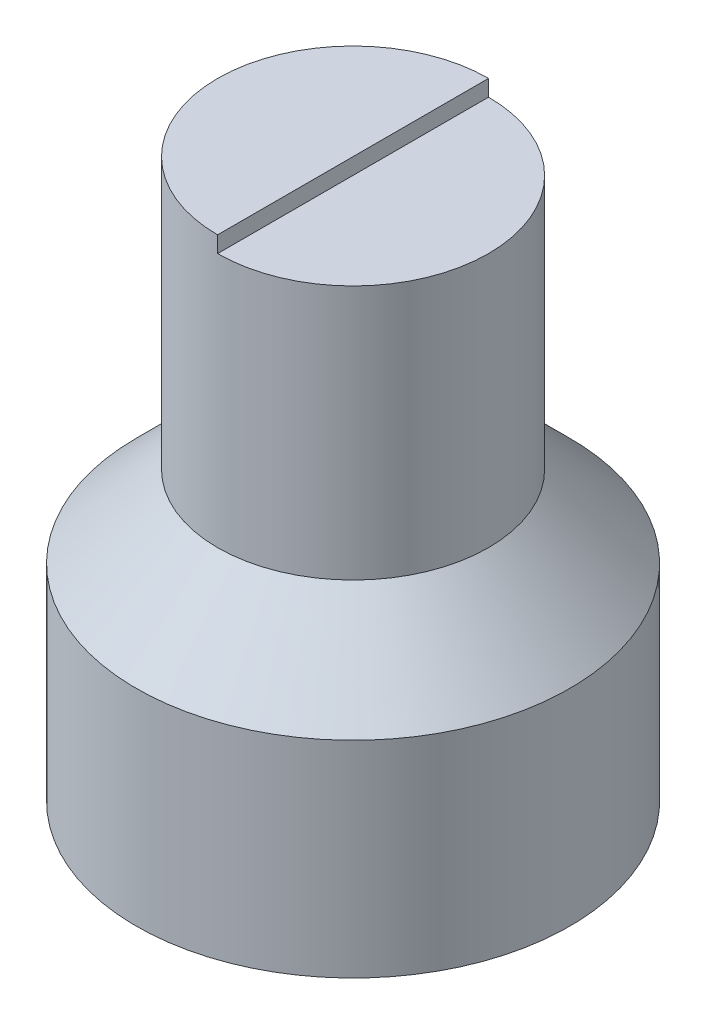
ISO-10303-21;
HEADER;
FILE_DESCRIPTION(('STEP AP214'),'2;1');
FILE_NAME('part.step','',(''),(''),'','','');
FILE_SCHEMA(('AUTOMOTIVE_DESIGN { 1 0 10303 214 1 1 1 1 }'));
ENDSEC;
DATA;
#1=APPLICATION_CONTEXT('core data for automotive mechanical design processes');
#2=APPLICATION_PROTOCOL_DEFINITION('international standard','automotive_design',2000,#1);
#3=PRODUCT_CONTEXT('',#1,'mechanical');
#4=PRODUCT('Part','Part','',(#3));
#5=PRODUCT_RELATED_PRODUCT_CATEGORY('part','',(#4));
#6=PRODUCT_DEFINITION_FORMATION('','',#4);
#7=PRODUCT_DEFINITION_CONTEXT('part definition',#1,'design');
#8=PRODUCT_DEFINITION('design','',#6,#7);
#9=PRODUCT_DEFINITION_SHAPE('','',#8);
#10=(LENGTH_UNIT() NAMED_UNIT(*) SI_UNIT(.MILLI.,.METRE.));
#11=(NAMED_UNIT(*) PLANE_ANGLE_UNIT() SI_UNIT($,.RADIAN.));
#12=(NAMED_UNIT(*) SI_UNIT($,.STERADIAN.) SOLID_ANGLE_UNIT());
#13=UNCERTAINTY_MEASURE_WITH_UNIT(LENGTH_MEASURE(1.E-05),#10,'distance_accuracy_value','');
#14=(GEOMETRIC_REPRESENTATION_CONTEXT(3) GLOBAL_UNCERTAINTY_ASSIGNED_CONTEXT((#13)) GLOBAL_UNIT_ASSIGNED_CONTEXT((#10,
#11,#12)) REPRESENTATION_CONTEXT('',''));
#15=CARTESIAN_POINT('',(0.,0.,0.));
#16=DIRECTION('',(0.,0.,1.));
#17=DIRECTION('',(1.,0.,0.));
#18=AXIS2_PLACEMENT_3D('',#15,#16,#17);
#19=CARTESIAN_POINT('',(0.,-10.3,0.));
#20=DIRECTION('',(0.,-1.,0.));
#21=DIRECTION('',(1.,0.,0.));
#22=AXIS2_PLACEMENT_3D('',#19,#20,#21);
#23=PLANE('',#22);
#24=CARTESIAN_POINT('',(0.,-10.3,0.));
#25=DIRECTION('',(0.,-1.,0.));
#26=DIRECTION('',(1.,0.,0.));
#27=AXIS2_PLACEMENT_3D('',#24,#25,#26);
#28=CIRCLE('',#27,5.1);
#29=CARTESIAN_POINT('',(5.1,-10.3,0.));
#30=VERTEX_POINT('',#29);
#31=EDGE_CURVE('E86',#30,#30,#28,.T.);
#32=ORIENTED_EDGE('',*,*,#31,.F.);
#33=EDGE_LOOP('',(#32));
#34=FACE_BOUND('',#33,.T.);
#35=CARTESIAN_POINT('',(0.,-10.3,0.));
#36=DIRECTION('',(0.,1.,0.));
#37=DIRECTION('',(-1.,0.,0.));
#38=AXIS2_PLACEMENT_3D('',#35,#36,#37);
#39=CIRCLE('',#38,8.);
#40=CARTESIAN_POINT('',(-8.,-10.3,0.));
#41=VERTEX_POINT('',#40);
#42=EDGE_CURVE('E117',#41,#41,#39,.T.);
#43=ORIENTED_EDGE('',*,*,#42,.F.);
#44=EDGE_LOOP('',(#43));
#45=FACE_BOUND('',#44,.T.);
#46=ADVANCED_FACE('F43',(#34,#45),#23,.T.);
#47=CARTESIAN_POINT('',(0.,10.3,0.));
#48=DIRECTION('',(0.,1.,0.));
#49=DIRECTION('',(-1.,0.,0.));
#50=AXIS2_PLACEMENT_3D('',#47,#48,#49);
#51=CYLINDRICAL_SURFACE('',#50,8.);
#52=CARTESIAN_POINT('',(0.,-2.70000000000001,0.));
#53=DIRECTION('',(0.,1.,0.));
#54=DIRECTION('',(-1.,0.,0.));
#55=AXIS2_PLACEMENT_3D('',#52,#53,#54);
#56=CIRCLE('',#55,8.);
#57=CARTESIAN_POINT('',(-8.,-2.70000000000001,0.));
#58=VERTEX_POINT('',#57);
#59=EDGE_CURVE('E11',#58,#58,#56,.F.);
#60=ORIENTED_EDGE('',*,*,#59,.T.);
#61=EDGE_LOOP('',(#60));
#62=FACE_BOUND('',#61,.T.);
#63=ORIENTED_EDGE('',*,*,#42,.T.);
#64=EDGE_LOOP('',(#63));
#65=FACE_BOUND('',#64,.T.);
#66=ADVANCED_FACE('F140',(#62,#65),#51,.T.);
#67=CARTESIAN_POINT('',(0.,10.3,0.));
#68=DIRECTION('',(0.,1.,0.));
#69=DIRECTION('',(-1.,0.,0.));
#70=AXIS2_PLACEMENT_3D('',#67,#68,#69);
#71=CYLINDRICAL_SURFACE('',#70,5.);
#72=DIRECTION('',(0.,1.,0.));
#73=VECTOR('',#72,1.);
#74=CARTESIAN_POINT('',(0.,9.7,5.));
#75=LINE('',#74,#73);
#76=CARTESIAN_POINT('',(0.,9.7,5.));
#77=VERTEX_POINT('',#76);
#78=CARTESIAN_POINT('',(0.,10.3,5.));
#79=VERTEX_POINT('',#78);
#80=EDGE_CURVE('E65',#77,#79,#75,.T.);
#81=ORIENTED_EDGE('',*,*,#80,.T.);
#82=CARTESIAN_POINT('',(0.,10.3,0.));
#83=DIRECTION('',(0.,1.,0.));
#84=DIRECTION('',(-1.,0.,0.));
#85=AXIS2_PLACEMENT_3D('',#82,#83,#84);
#86=CIRCLE('',#85,5.);
#87=CARTESIAN_POINT('',(0.,10.3,-5.));
#88=VERTEX_POINT('',#87);
#89=EDGE_CURVE('E107',#88,#79,#86,.T.);
#90=ORIENTED_EDGE('',*,*,#89,.F.);
#91=DIRECTION('',(0.,1.,0.));
#92=VECTOR('',#91,1.);
#93=CARTESIAN_POINT('',(0.,9.7,-5.));
#94=LINE('',#93,#92);
#95=CARTESIAN_POINT('',(0.,9.7,-5.));
#96=VERTEX_POINT('',#95);
#97=EDGE_CURVE('E59',#96,#88,#94,.T.);
#98=ORIENTED_EDGE('',*,*,#97,.F.);
#99=CARTESIAN_POINT('',(0.,9.7,0.));
#100=DIRECTION('',(0.,1.,0.));
#101=DIRECTION('',(-1.,0.,0.));
#102=AXIS2_PLACEMENT_3D('',#99,#100,#101);
#103=CIRCLE('',#102,5.);
#104=EDGE_CURVE('E52',#96,#77,#103,.F.);
#105=ORIENTED_EDGE('',*,*,#104,.T.);
#106=EDGE_LOOP('',(#81,#90,#98,#105));
#107=FACE_BOUND('',#106,.T.);
#108=CARTESIAN_POINT('',(0.,0.300000000000003,0.));
#109=DIRECTION('',(0.,1.,0.));
#110=DIRECTION('',(-1.,0.,0.));
#111=AXIS2_PLACEMENT_3D('',#108,#109,#110);
#112=CIRCLE('',#111,5.00000000000001);
#113=CARTESIAN_POINT('',(-5.00000000000001,0.300000000000002,0.));
#114=VERTEX_POINT('',#113);
#115=EDGE_CURVE('E113',#114,#114,#112,.T.);
#116=ORIENTED_EDGE('',*,*,#115,.T.);
#117=EDGE_LOOP('',(#116));
#118=FACE_BOUND('',#117,.T.);
#119=ADVANCED_FACE('F123',(#107,#118),#71,.T.);
#120=CARTESIAN_POINT('',(0.,10.3,0.));
#121=DIRECTION('',(0.,1.,0.));
#122=DIRECTION('',(-1.,0.,0.));
#123=AXIS2_PLACEMENT_3D('',#120,#121,#122);
#124=PLANE('',#123);
#125=DIRECTION('',(0.,0.,1.));
#126=VECTOR('',#125,1.);
#127=CARTESIAN_POINT('',(0.,10.3,5.));
#128=LINE('',#127,#126);
#129=EDGE_CURVE('E72',#88,#79,#128,.T.);
#130=ORIENTED_EDGE('',*,*,#129,.F.);
#131=ORIENTED_EDGE('',*,*,#89,.T.);
#132=EDGE_LOOP('',(#130,#131));
#133=FACE_BOUND('',#132,.T.);
#134=ADVANCED_FACE('F130',(#133),#124,.T.);
#135=CARTESIAN_POINT('',(0.,9.7,5.));
#136=DIRECTION('',(-1.,0.,0.));
#137=DIRECTION('',(0.,-1.,0.));
#138=AXIS2_PLACEMENT_3D('',#135,#136,#137);
#139=PLANE('',#138);
#140=ORIENTED_EDGE('',*,*,#129,.T.);
#141=ORIENTED_EDGE('',*,*,#80,.F.);
#142=DIRECTION('',(0.,0.,1.));
#143=VECTOR('',#142,1.);
#144=CARTESIAN_POINT('',(0.,9.7,5.));
#145=LINE('',#144,#143);
#146=EDGE_CURVE('E100',#96,#77,#145,.T.);
#147=ORIENTED_EDGE('',*,*,#146,.F.);
#148=ORIENTED_EDGE('',*,*,#97,.T.);
#149=EDGE_LOOP('',(#140,#141,#147,#148));
#150=FACE_BOUND('',#149,.T.);
#151=ADVANCED_FACE('F128',(#150),#139,.F.);
#152=CARTESIAN_POINT('',(0.,9.7,0.));
#153=DIRECTION('',(0.,1.,0.));
#154=DIRECTION('',(-1.,0.,0.));
#155=AXIS2_PLACEMENT_3D('',#152,#153,#154);
#156=PLANE('',#155);
#157=ORIENTED_EDGE('',*,*,#146,.T.);
#158=ORIENTED_EDGE('',*,*,#104,.F.);
#159=EDGE_LOOP('',(#157,#158));
#160=FACE_BOUND('',#159,.T.);
#161=ADVANCED_FACE('F127',(#160),#156,.T.);
#162=CARTESIAN_POINT('',(0.,0.300000000000003,0.));
#163=DIRECTION('',(0.,-1.,0.));
#164=DIRECTION('',(1.,0.,0.));
#165=AXIS2_PLACEMENT_3D('',#162,#163,#164);
#166=CONICAL_SURFACE('',#165,5.,0.785398163397447);
#167=ORIENTED_EDGE('',*,*,#59,.F.);
#168=EDGE_LOOP('',(#167));
#169=FACE_BOUND('',#168,.T.);
#170=ORIENTED_EDGE('',*,*,#115,.F.);
#171=EDGE_LOOP('',(#170));
#172=FACE_BOUND('',#171,.T.);
#173=ADVANCED_FACE('F45',(#169,#172),#166,.T.);
#174=CARTESIAN_POINT('',(0.,-5.2,0.));
#175=DIRECTION('',(0.,-1.,0.));
#176=DIRECTION('',(1.,0.,0.));
#177=AXIS2_PLACEMENT_3D('',#174,#175,#176);
#178=CYLINDRICAL_SURFACE('',#177,5.1);
#179=CARTESIAN_POINT('',(0.,-5.2,0.));
#180=DIRECTION('',(0.,-1.,0.));
#181=DIRECTION('',(1.,0.,0.));
#182=AXIS2_PLACEMENT_3D('',#179,#180,#181);
#183=CIRCLE('',#182,5.1);
#184=CARTESIAN_POINT('',(5.1,-5.2,0.));
#185=VERTEX_POINT('',#184);
#186=EDGE_CURVE('E92',#185,#185,#183,.T.);
#187=ORIENTED_EDGE('',*,*,#186,.F.);
#188=EDGE_LOOP('',(#187));
#189=FACE_BOUND('',#188,.T.);
#190=ORIENTED_EDGE('',*,*,#31,.T.);
#191=EDGE_LOOP('',(#190));
#192=FACE_BOUND('',#191,.T.);
#193=ADVANCED_FACE('F182',(#189,#192),#178,.F.);
#194=CARTESIAN_POINT('',(0.,-5.2,0.));
#195=DIRECTION('',(0.,-1.,0.));
#196=DIRECTION('',(1.,0.,0.));
#197=AXIS2_PLACEMENT_3D('',#194,#195,#196);
#198=PLANE('',#197);
#199=CARTESIAN_POINT('',(0.,-5.2,0.));
#200=DIRECTION('',(0.,-1.,0.));
#201=DIRECTION('',(0.,0.,-1.));
#202=AXIS2_PLACEMENT_3D('',#199,#200,#201);
#203=CIRCLE('',#202,1.25);
#204=CARTESIAN_POINT('',(0.,-5.2,-1.25));
#205=VERTEX_POINT('',#204);
#206=EDGE_CURVE('E87',#205,#205,#203,.T.);
#207=ORIENTED_EDGE('',*,*,#206,.F.);
#208=EDGE_LOOP('',(#207));
#209=FACE_BOUND('',#208,.T.);
#210=ORIENTED_EDGE('',*,*,#186,.T.);
#211=EDGE_LOOP('',(#210));
#212=FACE_BOUND('',#211,.T.);
#213=ADVANCED_FACE('F79',(#209,#212),#198,.T.);
#214=CARTESIAN_POINT('',(0.,4.8,0.));
#215=DIRECTION('',(0.,-1.,0.));
#216=DIRECTION('',(0.,0.,-1.));
#217=AXIS2_PLACEMENT_3D('',#214,#215,#216);
#218=CONICAL_SURFACE('',#217,1.25,1.02974425867665);
#219=CARTESIAN_POINT('',(0.,5.55107577378445,0.));
#220=VERTEX_POINT('',#219);
#221=VERTEX_LOOP('',#220);
#222=FACE_BOUND('',#221,.T.);
#223=CARTESIAN_POINT('',(0.,4.8,0.));
#224=DIRECTION('',(0.,-1.,0.));
#225=DIRECTION('',(0.,0.,-1.));
#226=AXIS2_PLACEMENT_3D('',#223,#224,#225);
#227=CIRCLE('',#226,1.25);
#228=CARTESIAN_POINT('',(0.,4.8,-1.25));
#229=VERTEX_POINT('',#228);
#230=EDGE_CURVE('E83',#229,#229,#227,.T.);
#231=ORIENTED_EDGE('',*,*,#230,.T.);
#232=EDGE_LOOP('',(#231));
#233=FACE_BOUND('',#232,.T.);
#234=ADVANCED_FACE('F75',(#222,#233),#218,.F.);
#235=CARTESIAN_POINT('',(0.,-5.2,0.));
#236=DIRECTION('',(0.,-1.,0.));
#237=DIRECTION('',(0.,0.,-1.));
#238=AXIS2_PLACEMENT_3D('',#235,#236,#237);
#239=CYLINDRICAL_SURFACE('',#238,1.25);
#240=ORIENTED_EDGE('',*,*,#230,.F.);
#241=EDGE_LOOP('',(#240));
#242=FACE_BOUND('',#241,.T.);
#243=ORIENTED_EDGE('',*,*,#206,.T.);
#244=EDGE_LOOP('',(#243));
#245=FACE_BOUND('',#244,.T.);
#246=ADVANCED_FACE('F78',(#242,#245),#239,.F.);
#247=CLOSED_SHELL('',(#46,#66,#119,#134,#151,#161,#173,#193,#213,#234,#246));
#248=MANIFOLD_SOLID_BREP('B2',#247);
#249=ADVANCED_BREP_SHAPE_REPRESENTATION('',(#18,#248),#14);
#250=SHAPE_DEFINITION_REPRESENTATION(#9,#249);
ENDSEC;
END-ISO-10303-21;
